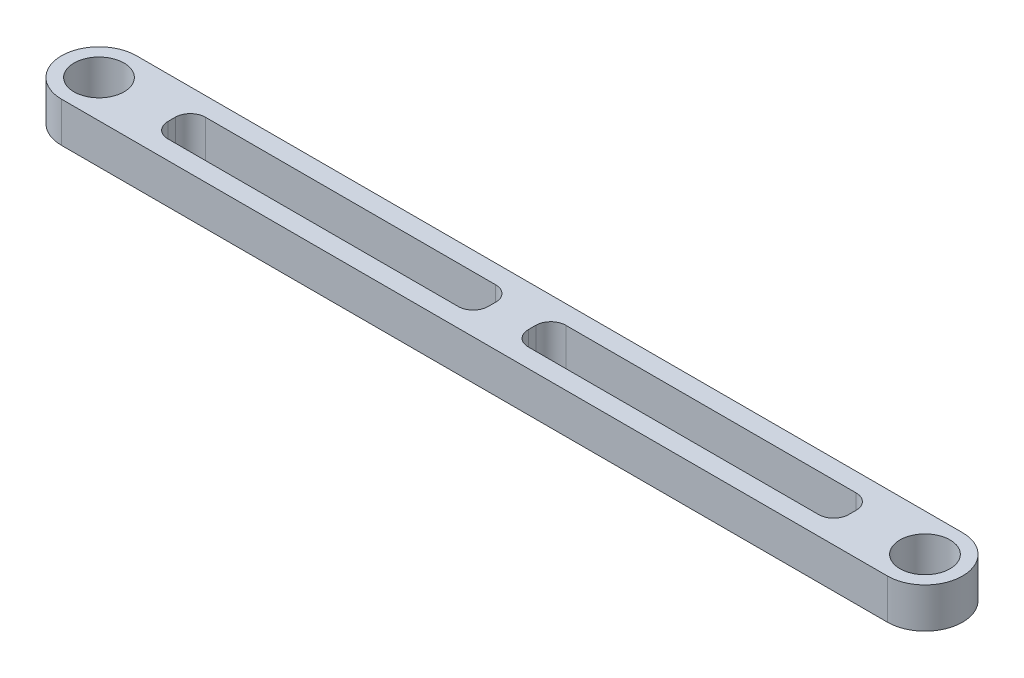
ISO-10303-21;
HEADER;
FILE_DESCRIPTION(('STEP AP214'),'2;1');
FILE_NAME('part.step','',(''),(''),'','','');
FILE_SCHEMA(('AUTOMOTIVE_DESIGN { 1 0 10303 214 1 1 1 1 }'));
ENDSEC;
DATA;
#1=APPLICATION_CONTEXT('core data for automotive mechanical design processes');
#2=APPLICATION_PROTOCOL_DEFINITION('international standard','automotive_design',2000,#1);
#3=PRODUCT_CONTEXT('',#1,'mechanical');
#4=PRODUCT('Part','Part','',(#3));
#5=PRODUCT_RELATED_PRODUCT_CATEGORY('part','',(#4));
#6=PRODUCT_DEFINITION_FORMATION('','',#4);
#7=PRODUCT_DEFINITION_CONTEXT('part definition',#1,'design');
#8=PRODUCT_DEFINITION('design','',#6,#7);
#9=PRODUCT_DEFINITION_SHAPE('','',#8);
#10=(LENGTH_UNIT() NAMED_UNIT(*) SI_UNIT(.MILLI.,.METRE.));
#11=(NAMED_UNIT(*) PLANE_ANGLE_UNIT() SI_UNIT($,.RADIAN.));
#12=(NAMED_UNIT(*) SI_UNIT($,.STERADIAN.) SOLID_ANGLE_UNIT());
#13=UNCERTAINTY_MEASURE_WITH_UNIT(LENGTH_MEASURE(1.E-05),#10,'distance_accuracy_value','');
#14=(GEOMETRIC_REPRESENTATION_CONTEXT(3) GLOBAL_UNCERTAINTY_ASSIGNED_CONTEXT((#13)) GLOBAL_UNIT_ASSIGNED_CONTEXT((#10,
#11,#12)) REPRESENTATION_CONTEXT('',''));
#15=CARTESIAN_POINT('',(0.,0.,0.));
#16=DIRECTION('',(0.,0.,1.));
#17=DIRECTION('',(1.,0.,0.));
#18=AXIS2_PLACEMENT_3D('',#15,#16,#17);
#19=CARTESIAN_POINT('',(0.,8.,-3.75));
#20=DIRECTION('',(0.,0.,1.));
#21=DIRECTION('',(1.,0.,0.));
#22=AXIS2_PLACEMENT_3D('',#19,#20,#21);
#23=PLANE('',#22);
#24=DIRECTION('',(-1.,0.,0.));
#25=VECTOR('',#24,1.);
#26=CARTESIAN_POINT('',(0.,0.,-3.75));
#27=LINE('',#26,#25);
#28=CARTESIAN_POINT('',(147.5,0.,-3.75));
#29=VERTEX_POINT('',#28);
#30=CARTESIAN_POINT('',(89.5,0.,-3.75));
#31=VERTEX_POINT('',#30);
#32=EDGE_CURVE('E331',#29,#31,#27,.T.);
#33=ORIENTED_EDGE('',*,*,#32,.F.);
#34=DIRECTION('',(0.,-1.,0.));
#35=VECTOR('',#34,1.);
#36=CARTESIAN_POINT('',(147.5,8.,-3.75));
#37=LINE('',#36,#35);
#38=CARTESIAN_POINT('',(147.5,8.,-3.75));
#39=VERTEX_POINT('',#38);
#40=EDGE_CURVE('E218',#29,#39,#37,.F.);
#41=ORIENTED_EDGE('',*,*,#40,.T.);
#42=DIRECTION('',(-1.,0.,0.));
#43=VECTOR('',#42,1.);
#44=CARTESIAN_POINT('',(0.,8.,-3.75));
#45=LINE('',#44,#43);
#46=CARTESIAN_POINT('',(89.5,8.,-3.75));
#47=VERTEX_POINT('',#46);
#48=EDGE_CURVE('E292',#39,#47,#45,.T.);
#49=ORIENTED_EDGE('',*,*,#48,.T.);
#50=DIRECTION('',(0.,-1.,0.));
#51=VECTOR('',#50,1.);
#52=CARTESIAN_POINT('',(89.5,0.,-3.75));
#53=LINE('',#52,#51);
#54=EDGE_CURVE('E215',#47,#31,#53,.T.);
#55=ORIENTED_EDGE('',*,*,#54,.T.);
#56=EDGE_LOOP('',(#33,#41,#49,#55));
#57=FACE_BOUND('',#56,.T.);
#58=ADVANCED_FACE('F37',(#57),#23,.T.);
#59=CARTESIAN_POINT('',(150.5,8.,0.));
#60=DIRECTION('',(1.,0.,0.));
#61=DIRECTION('',(0.,0.,-1.));
#62=AXIS2_PLACEMENT_3D('',#59,#60,#61);
#63=PLANE('',#62);
#64=DIRECTION('',(0.,0.,1.));
#65=VECTOR('',#64,1.);
#66=CARTESIAN_POINT('',(150.5,0.,0.));
#67=LINE('',#66,#65);
#68=CARTESIAN_POINT('',(150.5,0.,-0.749999999999999));
#69=VERTEX_POINT('',#68);
#70=CARTESIAN_POINT('',(150.5,0.,0.750000000000001));
#71=VERTEX_POINT('',#70);
#72=EDGE_CURVE('E334',#69,#71,#67,.T.);
#73=ORIENTED_EDGE('',*,*,#72,.T.);
#74=DIRECTION('',(0.,-1.,0.));
#75=VECTOR('',#74,1.);
#76=CARTESIAN_POINT('',(150.5,8.,0.750000000000001));
#77=LINE('',#76,#75);
#78=CARTESIAN_POINT('',(150.5,8.,0.750000000000001));
#79=VERTEX_POINT('',#78);
#80=EDGE_CURVE('E213',#71,#79,#77,.F.);
#81=ORIENTED_EDGE('',*,*,#80,.T.);
#82=DIRECTION('',(0.,0.,1.));
#83=VECTOR('',#82,1.);
#84=CARTESIAN_POINT('',(150.5,8.,0.));
#85=LINE('',#84,#83);
#86=CARTESIAN_POINT('',(150.5,8.,-0.749999999999999));
#87=VERTEX_POINT('',#86);
#88=EDGE_CURVE('E296',#87,#79,#85,.T.);
#89=ORIENTED_EDGE('',*,*,#88,.F.);
#90=DIRECTION('',(0.,-1.,0.));
#91=VECTOR('',#90,1.);
#92=CARTESIAN_POINT('',(150.5,8.,-0.749999999999999));
#93=LINE('',#92,#91);
#94=EDGE_CURVE('E210',#87,#69,#93,.T.);
#95=ORIENTED_EDGE('',*,*,#94,.T.);
#96=EDGE_LOOP('',(#73,#81,#89,#95));
#97=FACE_BOUND('',#96,.T.);
#98=ADVANCED_FACE('F388',(#97),#63,.F.);
#99=CARTESIAN_POINT('',(0.,8.,3.75));
#100=DIRECTION('',(0.,0.,1.));
#101=DIRECTION('',(1.,0.,0.));
#102=AXIS2_PLACEMENT_3D('',#99,#100,#101);
#103=PLANE('',#102);
#104=DIRECTION('',(-1.,0.,0.));
#105=VECTOR('',#104,1.);
#106=CARTESIAN_POINT('',(0.,8.,3.75));
#107=LINE('',#106,#105);
#108=CARTESIAN_POINT('',(147.5,8.,3.75));
#109=VERTEX_POINT('',#108);
#110=CARTESIAN_POINT('',(89.5,8.,3.75));
#111=VERTEX_POINT('',#110);
#112=EDGE_CURVE('E304',#109,#111,#107,.T.);
#113=ORIENTED_EDGE('',*,*,#112,.F.);
#114=DIRECTION('',(0.,-1.,0.));
#115=VECTOR('',#114,1.);
#116=CARTESIAN_POINT('',(147.5,0.,3.75));
#117=LINE('',#116,#115);
#118=CARTESIAN_POINT('',(147.5,0.,3.75));
#119=VERTEX_POINT('',#118);
#120=EDGE_CURVE('E202',#109,#119,#117,.T.);
#121=ORIENTED_EDGE('',*,*,#120,.T.);
#122=DIRECTION('',(-1.,0.,0.));
#123=VECTOR('',#122,1.);
#124=CARTESIAN_POINT('',(0.,0.,3.75));
#125=LINE('',#124,#123);
#126=CARTESIAN_POINT('',(89.5,0.,3.75));
#127=VERTEX_POINT('',#126);
#128=EDGE_CURVE('E337',#119,#127,#125,.T.);
#129=ORIENTED_EDGE('',*,*,#128,.T.);
#130=DIRECTION('',(0.,-1.,0.));
#131=VECTOR('',#130,1.);
#132=CARTESIAN_POINT('',(89.5,8.,3.75));
#133=LINE('',#132,#131);
#134=EDGE_CURVE('E200',#127,#111,#133,.F.);
#135=ORIENTED_EDGE('',*,*,#134,.T.);
#136=EDGE_LOOP('',(#113,#121,#129,#135));
#137=FACE_BOUND('',#136,.T.);
#138=ADVANCED_FACE('F394',(#137),#103,.F.);
#139=CARTESIAN_POINT('',(0.,8.,-3.75));
#140=DIRECTION('',(0.,0.,-1.));
#141=DIRECTION('',(-1.,0.,0.));
#142=AXIS2_PLACEMENT_3D('',#139,#140,#141);
#143=PLANE('',#142);
#144=DIRECTION('',(1.,0.,0.));
#145=VECTOR('',#144,1.);
#146=CARTESIAN_POINT('',(0.,0.,-3.75));
#147=LINE('',#146,#145);
#148=CARTESIAN_POINT('',(17.5,0.,-3.75));
#149=VERTEX_POINT('',#148);
#150=CARTESIAN_POINT('',(75.5,0.,-3.75));
#151=VERTEX_POINT('',#150);
#152=EDGE_CURVE('E325',#149,#151,#147,.T.);
#153=ORIENTED_EDGE('',*,*,#152,.T.);
#154=DIRECTION('',(0.,-1.,0.));
#155=VECTOR('',#154,1.);
#156=CARTESIAN_POINT('',(75.5,8.,-3.75));
#157=LINE('',#156,#155);
#158=CARTESIAN_POINT('',(75.5,8.,-3.75));
#159=VERTEX_POINT('',#158);
#160=EDGE_CURVE('E238',#151,#159,#157,.F.);
#161=ORIENTED_EDGE('',*,*,#160,.T.);
#162=DIRECTION('',(1.,0.,0.));
#163=VECTOR('',#162,1.);
#164=CARTESIAN_POINT('',(0.,8.,-3.75));
#165=LINE('',#164,#163);
#166=CARTESIAN_POINT('',(17.5,8.,-3.75));
#167=VERTEX_POINT('',#166);
#168=EDGE_CURVE('E356',#167,#159,#165,.T.);
#169=ORIENTED_EDGE('',*,*,#168,.F.);
#170=DIRECTION('',(0.,-1.,0.));
#171=VECTOR('',#170,1.);
#172=CARTESIAN_POINT('',(17.5,8.,-3.75));
#173=LINE('',#172,#171);
#174=EDGE_CURVE('E235',#167,#149,#173,.T.);
#175=ORIENTED_EDGE('',*,*,#174,.T.);
#176=EDGE_LOOP('',(#153,#161,#169,#175));
#177=FACE_BOUND('',#176,.T.);
#178=ADVANCED_FACE('F376',(#177),#143,.F.);
#179=CARTESIAN_POINT('',(78.5,8.,0.));
#180=DIRECTION('',(1.,0.,0.));
#181=DIRECTION('',(0.,0.,-1.));
#182=AXIS2_PLACEMENT_3D('',#179,#180,#181);
#183=PLANE('',#182);
#184=DIRECTION('',(0.,0.,1.));
#185=VECTOR('',#184,1.);
#186=CARTESIAN_POINT('',(78.5,0.,0.));
#187=LINE('',#186,#185);
#188=CARTESIAN_POINT('',(78.5,0.,-0.749999999999999));
#189=VERTEX_POINT('',#188);
#190=CARTESIAN_POINT('',(78.5,0.,0.750000000000001));
#191=VERTEX_POINT('',#190);
#192=EDGE_CURVE('E287',#189,#191,#187,.T.);
#193=ORIENTED_EDGE('',*,*,#192,.T.);
#194=DIRECTION('',(0.,-1.,0.));
#195=VECTOR('',#194,1.);
#196=CARTESIAN_POINT('',(78.5,8.,0.750000000000001));
#197=LINE('',#196,#195);
#198=CARTESIAN_POINT('',(78.5,8.,0.750000000000001));
#199=VERTEX_POINT('',#198);
#200=EDGE_CURVE('E233',#191,#199,#197,.F.);
#201=ORIENTED_EDGE('',*,*,#200,.T.);
#202=DIRECTION('',(0.,0.,1.));
#203=VECTOR('',#202,1.);
#204=CARTESIAN_POINT('',(78.5,8.,0.));
#205=LINE('',#204,#203);
#206=CARTESIAN_POINT('',(78.5,8.,-0.749999999999999));
#207=VERTEX_POINT('',#206);
#208=EDGE_CURVE('E298',#207,#199,#205,.T.);
#209=ORIENTED_EDGE('',*,*,#208,.F.);
#210=DIRECTION('',(0.,-1.,0.));
#211=VECTOR('',#210,1.);
#212=CARTESIAN_POINT('',(78.5,0.,-0.749999999999999));
#213=LINE('',#212,#211);
#214=EDGE_CURVE('E230',#207,#189,#213,.T.);
#215=ORIENTED_EDGE('',*,*,#214,.T.);
#216=EDGE_LOOP('',(#193,#201,#209,#215));
#217=FACE_BOUND('',#216,.T.);
#218=ADVANCED_FACE('F371',(#217),#183,.F.);
#219=CARTESIAN_POINT('',(0.,8.,3.75));
#220=DIRECTION('',(0.,0.,-1.));
#221=DIRECTION('',(-1.,0.,0.));
#222=AXIS2_PLACEMENT_3D('',#219,#220,#221);
#223=PLANE('',#222);
#224=DIRECTION('',(1.,0.,0.));
#225=VECTOR('',#224,1.);
#226=CARTESIAN_POINT('',(0.,8.,3.75));
#227=LINE('',#226,#225);
#228=CARTESIAN_POINT('',(17.5,8.,3.75));
#229=VERTEX_POINT('',#228);
#230=CARTESIAN_POINT('',(75.5,8.,3.75));
#231=VERTEX_POINT('',#230);
#232=EDGE_CURVE('E293',#229,#231,#227,.T.);
#233=ORIENTED_EDGE('',*,*,#232,.T.);
#234=DIRECTION('',(0.,-1.,0.));
#235=VECTOR('',#234,1.);
#236=CARTESIAN_POINT('',(75.5,8.,3.75));
#237=LINE('',#236,#235);
#238=CARTESIAN_POINT('',(75.5,0.,3.75));
#239=VERTEX_POINT('',#238);
#240=EDGE_CURVE('E227',#231,#239,#237,.T.);
#241=ORIENTED_EDGE('',*,*,#240,.T.);
#242=DIRECTION('',(1.,0.,0.));
#243=VECTOR('',#242,1.);
#244=CARTESIAN_POINT('',(0.,0.,3.75));
#245=LINE('',#244,#243);
#246=CARTESIAN_POINT('',(17.5,0.,3.75));
#247=VERTEX_POINT('',#246);
#248=EDGE_CURVE('E278',#247,#239,#245,.T.);
#249=ORIENTED_EDGE('',*,*,#248,.F.);
#250=DIRECTION('',(0.,-1.,0.));
#251=VECTOR('',#250,1.);
#252=CARTESIAN_POINT('',(17.5,8.,3.75));
#253=LINE('',#252,#251);
#254=EDGE_CURVE('E225',#247,#229,#253,.F.);
#255=ORIENTED_EDGE('',*,*,#254,.T.);
#256=EDGE_LOOP('',(#233,#241,#249,#255));
#257=FACE_BOUND('',#256,.T.);
#258=ADVANCED_FACE('F285',(#257),#223,.T.);
#259=CARTESIAN_POINT('',(0.,8.,7.5));
#260=DIRECTION('',(0.,0.,-1.));
#261=DIRECTION('',(-1.,0.,0.));
#262=AXIS2_PLACEMENT_3D('',#259,#260,#261);
#263=PLANE('',#262);
#264=DIRECTION('',(1.,0.,0.));
#265=VECTOR('',#264,1.);
#266=CARTESIAN_POINT('',(0.,0.,7.5));
#267=LINE('',#266,#265);
#268=CARTESIAN_POINT('',(0.,0.,7.5));
#269=VERTEX_POINT('',#268);
#270=CARTESIAN_POINT('',(165.,0.,7.50000000000001));
#271=VERTEX_POINT('',#270);
#272=EDGE_CURVE('E199',#269,#271,#267,.T.);
#273=ORIENTED_EDGE('',*,*,#272,.T.);
#274=DIRECTION('',(0.,-1.,0.));
#275=VECTOR('',#274,1.);
#276=CARTESIAN_POINT('',(165.,8.,7.50000000000001));
#277=LINE('',#276,#275);
#278=CARTESIAN_POINT('',(165.,8.,7.50000000000001));
#279=VERTEX_POINT('',#278);
#280=EDGE_CURVE('E179',#279,#271,#277,.T.);
#281=ORIENTED_EDGE('',*,*,#280,.F.);
#282=DIRECTION('',(1.,0.,0.));
#283=VECTOR('',#282,1.);
#284=CARTESIAN_POINT('',(0.,8.,7.5));
#285=LINE('',#284,#283);
#286=CARTESIAN_POINT('',(0.,8.,7.5));
#287=VERTEX_POINT('',#286);
#288=EDGE_CURVE('E186',#287,#279,#285,.T.);
#289=ORIENTED_EDGE('',*,*,#288,.F.);
#290=DIRECTION('',(0.,-1.,0.));
#291=VECTOR('',#290,1.);
#292=CARTESIAN_POINT('',(0.,8.,7.5));
#293=LINE('',#292,#291);
#294=EDGE_CURVE('E316',#287,#269,#293,.T.);
#295=ORIENTED_EDGE('',*,*,#294,.T.);
#296=EDGE_LOOP('',(#273,#281,#289,#295));
#297=FACE_BOUND('',#296,.T.);
#298=ADVANCED_FACE('F197',(#297),#263,.F.);
#299=CARTESIAN_POINT('',(165.,8.,0.));
#300=DIRECTION('',(0.,-1.,0.));
#301=DIRECTION('',(0.,0.,-1.));
#302=AXIS2_PLACEMENT_3D('',#299,#300,#301);
#303=CYLINDRICAL_SURFACE('',#302,7.50000000000001);
#304=CARTESIAN_POINT('',(165.,0.,0.));
#305=DIRECTION('',(0.,1.,0.));
#306=DIRECTION('',(0.,0.,1.));
#307=AXIS2_PLACEMENT_3D('',#304,#305,#306);
#308=CIRCLE('',#307,7.50000000000001);
#309=CARTESIAN_POINT('',(165.,0.,-7.50000000000001));
#310=VERTEX_POINT('',#309);
#311=EDGE_CURVE('E318',#271,#310,#308,.T.);
#312=ORIENTED_EDGE('',*,*,#311,.T.);
#313=DIRECTION('',(0.,-1.,0.));
#314=VECTOR('',#313,1.);
#315=CARTESIAN_POINT('',(165.,8.,-7.50000000000001));
#316=LINE('',#315,#314);
#317=CARTESIAN_POINT('',(165.,8.,-7.50000000000001));
#318=VERTEX_POINT('',#317);
#319=EDGE_CURVE('E181',#318,#310,#316,.T.);
#320=ORIENTED_EDGE('',*,*,#319,.F.);
#321=CARTESIAN_POINT('',(165.,8.,0.));
#322=DIRECTION('',(0.,1.,0.));
#323=DIRECTION('',(0.,0.,1.));
#324=AXIS2_PLACEMENT_3D('',#321,#322,#323);
#325=CIRCLE('',#324,7.50000000000001);
#326=EDGE_CURVE('E174',#279,#318,#325,.T.);
#327=ORIENTED_EDGE('',*,*,#326,.F.);
#328=ORIENTED_EDGE('',*,*,#280,.T.);
#329=EDGE_LOOP('',(#312,#320,#327,#328));
#330=FACE_BOUND('',#329,.T.);
#331=ADVANCED_FACE('F177',(#330),#303,.T.);
#332=CARTESIAN_POINT('',(0.,8.,-7.5));
#333=DIRECTION('',(0.,0.,-1.));
#334=DIRECTION('',(-1.,0.,0.));
#335=AXIS2_PLACEMENT_3D('',#332,#333,#334);
#336=PLANE('',#335);
#337=DIRECTION('',(1.,0.,0.));
#338=VECTOR('',#337,1.);
#339=CARTESIAN_POINT('',(0.,0.,-7.5));
#340=LINE('',#339,#338);
#341=CARTESIAN_POINT('',(0.,0.,-7.5));
#342=VERTEX_POINT('',#341);
#343=EDGE_CURVE('E320',#342,#310,#340,.T.);
#344=ORIENTED_EDGE('',*,*,#343,.F.);
#345=DIRECTION('',(0.,-1.,0.));
#346=VECTOR('',#345,1.);
#347=CARTESIAN_POINT('',(0.,8.,-7.5));
#348=LINE('',#347,#346);
#349=CARTESIAN_POINT('',(0.,8.,-7.5));
#350=VERTEX_POINT('',#349);
#351=EDGE_CURVE('E204',#350,#342,#348,.T.);
#352=ORIENTED_EDGE('',*,*,#351,.F.);
#353=DIRECTION('',(1.,0.,0.));
#354=VECTOR('',#353,1.);
#355=CARTESIAN_POINT('',(0.,8.,-7.5));
#356=LINE('',#355,#354);
#357=EDGE_CURVE('E185',#350,#318,#356,.T.);
#358=ORIENTED_EDGE('',*,*,#357,.T.);
#359=ORIENTED_EDGE('',*,*,#319,.T.);
#360=EDGE_LOOP('',(#344,#352,#358,#359));
#361=FACE_BOUND('',#360,.T.);
#362=ADVANCED_FACE('F354',(#361),#336,.T.);
#363=CARTESIAN_POINT('',(0.,8.,0.));
#364=DIRECTION('',(0.,-1.,0.));
#365=DIRECTION('',(0.,0.,-1.));
#366=AXIS2_PLACEMENT_3D('',#363,#364,#365);
#367=CYLINDRICAL_SURFACE('',#366,5.);
#368=CARTESIAN_POINT('',(0.,8.,0.));
#369=DIRECTION('',(0.,1.,0.));
#370=DIRECTION('',(0.,0.,1.));
#371=AXIS2_PLACEMENT_3D('',#368,#369,#370);
#372=CIRCLE('',#371,5.);
#373=CARTESIAN_POINT('',(0.,8.,5.));
#374=VERTEX_POINT('',#373);
#375=EDGE_CURVE('E310',#374,#374,#372,.T.);
#376=ORIENTED_EDGE('',*,*,#375,.T.);
#377=EDGE_LOOP('',(#376));
#378=FACE_BOUND('',#377,.T.);
#379=CARTESIAN_POINT('',(0.,0.,0.));
#380=DIRECTION('',(0.,1.,0.));
#381=DIRECTION('',(0.,0.,1.));
#382=AXIS2_PLACEMENT_3D('',#379,#380,#381);
#383=CIRCLE('',#382,5.);
#384=CARTESIAN_POINT('',(0.,0.,5.));
#385=VERTEX_POINT('',#384);
#386=EDGE_CURVE('E343',#385,#385,#383,.T.);
#387=ORIENTED_EDGE('',*,*,#386,.F.);
#388=EDGE_LOOP('',(#387));
#389=FACE_BOUND('',#388,.T.);
#390=ADVANCED_FACE('F414',(#378,#389),#367,.F.);
#391=CARTESIAN_POINT('',(86.5,8.,0.));
#392=DIRECTION('',(1.,0.,0.));
#393=DIRECTION('',(0.,0.,-1.));
#394=AXIS2_PLACEMENT_3D('',#391,#392,#393);
#395=PLANE('',#394);
#396=DIRECTION('',(0.,0.,1.));
#397=VECTOR('',#396,1.);
#398=CARTESIAN_POINT('',(86.5,8.,0.));
#399=LINE('',#398,#397);
#400=CARTESIAN_POINT('',(86.5,8.,-0.749999999999999));
#401=VERTEX_POINT('',#400);
#402=CARTESIAN_POINT('',(86.5,8.,0.750000000000001));
#403=VERTEX_POINT('',#402);
#404=EDGE_CURVE('E307',#401,#403,#399,.T.);
#405=ORIENTED_EDGE('',*,*,#404,.T.);
#406=DIRECTION('',(0.,-1.,0.));
#407=VECTOR('',#406,1.);
#408=CARTESIAN_POINT('',(86.5,8.,0.750000000000001));
#409=LINE('',#408,#407);
#410=CARTESIAN_POINT('',(86.5,0.,0.750000000000001));
#411=VERTEX_POINT('',#410);
#412=EDGE_CURVE('E222',#403,#411,#409,.T.);
#413=ORIENTED_EDGE('',*,*,#412,.T.);
#414=DIRECTION('',(0.,0.,1.));
#415=VECTOR('',#414,1.);
#416=CARTESIAN_POINT('',(86.5,0.,0.));
#417=LINE('',#416,#415);
#418=CARTESIAN_POINT('',(86.5,0.,-0.749999999999999));
#419=VERTEX_POINT('',#418);
#420=EDGE_CURVE('E340',#419,#411,#417,.T.);
#421=ORIENTED_EDGE('',*,*,#420,.F.);
#422=DIRECTION('',(0.,-1.,0.));
#423=VECTOR('',#422,1.);
#424=CARTESIAN_POINT('',(86.5,8.,-0.749999999999999));
#425=LINE('',#424,#423);
#426=EDGE_CURVE('E220',#419,#401,#425,.F.);
#427=ORIENTED_EDGE('',*,*,#426,.T.);
#428=EDGE_LOOP('',(#405,#413,#421,#427));
#429=FACE_BOUND('',#428,.T.);
#430=ADVANCED_FACE('F402',(#429),#395,.T.);
#431=CARTESIAN_POINT('',(14.5,8.,0.));
#432=DIRECTION('',(1.,0.,0.));
#433=DIRECTION('',(0.,0.,-1.));
#434=AXIS2_PLACEMENT_3D('',#431,#432,#433);
#435=PLANE('',#434);
#436=DIRECTION('',(0.,0.,1.));
#437=VECTOR('',#436,1.);
#438=CARTESIAN_POINT('',(14.5,0.,0.));
#439=LINE('',#438,#437);
#440=CARTESIAN_POINT('',(14.5,0.,-0.749999999999999));
#441=VERTEX_POINT('',#440);
#442=CARTESIAN_POINT('',(14.5,0.,0.750000000000001));
#443=VERTEX_POINT('',#442);
#444=EDGE_CURVE('E279',#441,#443,#439,.T.);
#445=ORIENTED_EDGE('',*,*,#444,.F.);
#446=DIRECTION('',(0.,-1.,0.));
#447=VECTOR('',#446,1.);
#448=CARTESIAN_POINT('',(14.5,8.,-0.749999999999999));
#449=LINE('',#448,#447);
#450=CARTESIAN_POINT('',(14.5,8.,-0.749999999999999));
#451=VERTEX_POINT('',#450);
#452=EDGE_CURVE('E57',#441,#451,#449,.F.);
#453=ORIENTED_EDGE('',*,*,#452,.T.);
#454=DIRECTION('',(0.,0.,1.));
#455=VECTOR('',#454,1.);
#456=CARTESIAN_POINT('',(14.5,8.,0.));
#457=LINE('',#456,#455);
#458=CARTESIAN_POINT('',(14.5,8.,0.750000000000001));
#459=VERTEX_POINT('',#458);
#460=EDGE_CURVE('E290',#451,#459,#457,.T.);
#461=ORIENTED_EDGE('',*,*,#460,.T.);
#462=DIRECTION('',(0.,-1.,0.));
#463=VECTOR('',#462,1.);
#464=CARTESIAN_POINT('',(14.5,0.,0.750000000000001));
#465=LINE('',#464,#463);
#466=EDGE_CURVE('E240',#459,#443,#465,.T.);
#467=ORIENTED_EDGE('',*,*,#466,.T.);
#468=EDGE_LOOP('',(#445,#453,#461,#467));
#469=FACE_BOUND('',#468,.T.);
#470=ADVANCED_FACE('F289',(#469),#435,.T.);
#471=CARTESIAN_POINT('',(0.,8.,0.));
#472=DIRECTION('',(0.,-1.,0.));
#473=DIRECTION('',(0.,0.,-1.));
#474=AXIS2_PLACEMENT_3D('',#471,#472,#473);
#475=CYLINDRICAL_SURFACE('',#474,7.5);
#476=CARTESIAN_POINT('',(0.,0.,0.));
#477=DIRECTION('',(0.,1.,0.));
#478=DIRECTION('',(0.,0.,1.));
#479=AXIS2_PLACEMENT_3D('',#476,#477,#478);
#480=CIRCLE('',#479,7.5);
#481=EDGE_CURVE('E323',#342,#269,#480,.T.);
#482=ORIENTED_EDGE('',*,*,#481,.T.);
#483=ORIENTED_EDGE('',*,*,#294,.F.);
#484=CARTESIAN_POINT('',(0.,8.,0.));
#485=DIRECTION('',(0.,1.,0.));
#486=DIRECTION('',(0.,0.,1.));
#487=AXIS2_PLACEMENT_3D('',#484,#485,#486);
#488=CIRCLE('',#487,7.5);
#489=EDGE_CURVE('E191',#350,#287,#488,.T.);
#490=ORIENTED_EDGE('',*,*,#489,.F.);
#491=ORIENTED_EDGE('',*,*,#351,.T.);
#492=EDGE_LOOP('',(#482,#483,#490,#491));
#493=FACE_BOUND('',#492,.T.);
#494=ADVANCED_FACE('F350',(#493),#475,.T.);
#495=CARTESIAN_POINT('',(165.,8.,0.));
#496=DIRECTION('',(0.,-1.,0.));
#497=DIRECTION('',(0.,0.,-1.));
#498=AXIS2_PLACEMENT_3D('',#495,#496,#497);
#499=CYLINDRICAL_SURFACE('',#498,4.99999999999999);
#500=CARTESIAN_POINT('',(165.,8.,0.));
#501=DIRECTION('',(0.,1.,0.));
#502=DIRECTION('',(0.,0.,1.));
#503=AXIS2_PLACEMENT_3D('',#500,#501,#502);
#504=CIRCLE('',#503,4.99999999999999);
#505=CARTESIAN_POINT('',(165.,8.,4.99999999999999));
#506=VERTEX_POINT('',#505);
#507=EDGE_CURVE('E313',#506,#506,#504,.T.);
#508=ORIENTED_EDGE('',*,*,#507,.T.);
#509=EDGE_LOOP('',(#508));
#510=FACE_BOUND('',#509,.T.);
#511=CARTESIAN_POINT('',(165.,0.,0.));
#512=DIRECTION('',(0.,1.,0.));
#513=DIRECTION('',(0.,0.,1.));
#514=AXIS2_PLACEMENT_3D('',#511,#512,#513);
#515=CIRCLE('',#514,4.99999999999999);
#516=CARTESIAN_POINT('',(165.,0.,4.99999999999999));
#517=VERTEX_POINT('',#516);
#518=EDGE_CURVE('E195',#517,#517,#515,.T.);
#519=ORIENTED_EDGE('',*,*,#518,.F.);
#520=EDGE_LOOP('',(#519));
#521=FACE_BOUND('',#520,.T.);
#522=ADVANCED_FACE('F411',(#510,#521),#499,.F.);
#523=CARTESIAN_POINT('',(0.,8.,0.));
#524=DIRECTION('',(0.,1.,0.));
#525=DIRECTION('',(0.,0.,1.));
#526=AXIS2_PLACEMENT_3D('',#523,#524,#525);
#527=PLANE('',#526);
#528=ORIENTED_EDGE('',*,*,#288,.T.);
#529=ORIENTED_EDGE('',*,*,#326,.T.);
#530=ORIENTED_EDGE('',*,*,#357,.F.);
#531=ORIENTED_EDGE('',*,*,#489,.T.);
#532=EDGE_LOOP('',(#528,#529,#530,#531));
#533=FACE_BOUND('',#532,.T.);
#534=ORIENTED_EDGE('',*,*,#460,.F.);
#535=CARTESIAN_POINT('',(17.5,8.,-0.749999999999999));
#536=DIRECTION('',(0.,1.,0.));
#537=DIRECTION('',(0.,0.,1.));
#538=AXIS2_PLACEMENT_3D('',#535,#536,#537);
#539=CIRCLE('',#538,3.);
#540=EDGE_CURVE('E270',#451,#167,#539,.F.);
#541=ORIENTED_EDGE('',*,*,#540,.T.);
#542=ORIENTED_EDGE('',*,*,#168,.T.);
#543=CARTESIAN_POINT('',(75.5,8.,-0.749999999999999));
#544=DIRECTION('',(0.,1.,0.));
#545=DIRECTION('',(0.,0.,1.));
#546=AXIS2_PLACEMENT_3D('',#543,#544,#545);
#547=CIRCLE('',#546,3.);
#548=EDGE_CURVE('E266',#159,#207,#547,.F.);
#549=ORIENTED_EDGE('',*,*,#548,.T.);
#550=ORIENTED_EDGE('',*,*,#208,.T.);
#551=CARTESIAN_POINT('',(75.5,8.,0.750000000000001));
#552=DIRECTION('',(0.,1.,0.));
#553=DIRECTION('',(0.,0.,1.));
#554=AXIS2_PLACEMENT_3D('',#551,#552,#553);
#555=CIRCLE('',#554,3.);
#556=EDGE_CURVE('E262',#199,#231,#555,.F.);
#557=ORIENTED_EDGE('',*,*,#556,.T.);
#558=ORIENTED_EDGE('',*,*,#232,.F.);
#559=CARTESIAN_POINT('',(17.5,8.,0.750000000000001));
#560=DIRECTION('',(0.,1.,0.));
#561=DIRECTION('',(0.,0.,1.));
#562=AXIS2_PLACEMENT_3D('',#559,#560,#561);
#563=CIRCLE('',#562,3.);
#564=EDGE_CURVE('E11',#229,#459,#563,.F.);
#565=ORIENTED_EDGE('',*,*,#564,.T.);
#566=EDGE_LOOP('',(#534,#541,#542,#549,#550,#557,#558,#565));
#567=FACE_BOUND('',#566,.T.);
#568=ORIENTED_EDGE('',*,*,#48,.F.);
#569=CARTESIAN_POINT('',(147.5,8.,-0.749999999999999));
#570=DIRECTION('',(0.,1.,0.));
#571=DIRECTION('',(0.,0.,1.));
#572=AXIS2_PLACEMENT_3D('',#569,#570,#571);
#573=CIRCLE('',#572,3.);
#574=EDGE_CURVE('E250',#39,#87,#573,.F.);
#575=ORIENTED_EDGE('',*,*,#574,.T.);
#576=ORIENTED_EDGE('',*,*,#88,.T.);
#577=CARTESIAN_POINT('',(147.5,8.,0.750000000000001));
#578=DIRECTION('',(0.,1.,0.));
#579=DIRECTION('',(0.,0.,1.));
#580=AXIS2_PLACEMENT_3D('',#577,#578,#579);
#581=CIRCLE('',#580,3.);
#582=EDGE_CURVE('E246',#79,#109,#581,.F.);
#583=ORIENTED_EDGE('',*,*,#582,.T.);
#584=ORIENTED_EDGE('',*,*,#112,.T.);
#585=CARTESIAN_POINT('',(89.5,8.,0.750000000000001));
#586=DIRECTION('',(0.,1.,0.));
#587=DIRECTION('',(0.,0.,1.));
#588=AXIS2_PLACEMENT_3D('',#585,#586,#587);
#589=CIRCLE('',#588,3.);
#590=EDGE_CURVE('E254',#111,#403,#589,.F.);
#591=ORIENTED_EDGE('',*,*,#590,.T.);
#592=ORIENTED_EDGE('',*,*,#404,.F.);
#593=CARTESIAN_POINT('',(89.5,8.,-0.749999999999999));
#594=DIRECTION('',(0.,1.,0.));
#595=DIRECTION('',(0.,0.,1.));
#596=AXIS2_PLACEMENT_3D('',#593,#594,#595);
#597=CIRCLE('',#596,3.);
#598=EDGE_CURVE('E258',#401,#47,#597,.F.);
#599=ORIENTED_EDGE('',*,*,#598,.T.);
#600=EDGE_LOOP('',(#568,#575,#576,#583,#584,#591,#592,#599));
#601=FACE_BOUND('',#600,.T.);
#602=ORIENTED_EDGE('',*,*,#375,.F.);
#603=EDGE_LOOP('',(#602));
#604=FACE_BOUND('',#603,.T.);
#605=ORIENTED_EDGE('',*,*,#507,.F.);
#606=EDGE_LOOP('',(#605));
#607=FACE_BOUND('',#606,.T.);
#608=ADVANCED_FACE('F189',(#533,#567,#601,#604,#607),#527,.T.);
#609=CARTESIAN_POINT('',(0.,0.,0.));
#610=DIRECTION('',(0.,1.,0.));
#611=DIRECTION('',(0.,0.,1.));
#612=AXIS2_PLACEMENT_3D('',#609,#610,#611);
#613=PLANE('',#612);
#614=ORIENTED_EDGE('',*,*,#272,.F.);
#615=ORIENTED_EDGE('',*,*,#481,.F.);
#616=ORIENTED_EDGE('',*,*,#343,.T.);
#617=ORIENTED_EDGE('',*,*,#311,.F.);
#618=EDGE_LOOP('',(#614,#615,#616,#617));
#619=FACE_BOUND('',#618,.T.);
#620=ORIENTED_EDGE('',*,*,#152,.F.);
#621=CARTESIAN_POINT('',(17.5,0.,-0.749999999999999));
#622=DIRECTION('',(0.,1.,0.));
#623=DIRECTION('',(0.,0.,1.));
#624=AXIS2_PLACEMENT_3D('',#621,#622,#623);
#625=CIRCLE('',#624,3.);
#626=EDGE_CURVE('E268',#149,#441,#625,.T.);
#627=ORIENTED_EDGE('',*,*,#626,.T.);
#628=ORIENTED_EDGE('',*,*,#444,.T.);
#629=CARTESIAN_POINT('',(17.5,0.,0.750000000000001));
#630=DIRECTION('',(0.,1.,0.));
#631=DIRECTION('',(0.,0.,1.));
#632=AXIS2_PLACEMENT_3D('',#629,#630,#631);
#633=CIRCLE('',#632,3.);
#634=EDGE_CURVE('E45',#443,#247,#633,.T.);
#635=ORIENTED_EDGE('',*,*,#634,.T.);
#636=ORIENTED_EDGE('',*,*,#248,.T.);
#637=CARTESIAN_POINT('',(75.5,0.,0.750000000000001));
#638=DIRECTION('',(0.,1.,0.));
#639=DIRECTION('',(0.,0.,1.));
#640=AXIS2_PLACEMENT_3D('',#637,#638,#639);
#641=CIRCLE('',#640,3.);
#642=EDGE_CURVE('E260',#239,#191,#641,.T.);
#643=ORIENTED_EDGE('',*,*,#642,.T.);
#644=ORIENTED_EDGE('',*,*,#192,.F.);
#645=CARTESIAN_POINT('',(75.5,0.,-0.749999999999999));
#646=DIRECTION('',(0.,1.,0.));
#647=DIRECTION('',(0.,0.,1.));
#648=AXIS2_PLACEMENT_3D('',#645,#646,#647);
#649=CIRCLE('',#648,3.);
#650=EDGE_CURVE('E264',#189,#151,#649,.T.);
#651=ORIENTED_EDGE('',*,*,#650,.T.);
#652=EDGE_LOOP('',(#620,#627,#628,#635,#636,#643,#644,#651));
#653=FACE_BOUND('',#652,.T.);
#654=ORIENTED_EDGE('',*,*,#72,.F.);
#655=CARTESIAN_POINT('',(147.5,0.,-0.749999999999999));
#656=DIRECTION('',(0.,1.,0.));
#657=DIRECTION('',(0.,0.,1.));
#658=AXIS2_PLACEMENT_3D('',#655,#656,#657);
#659=CIRCLE('',#658,3.);
#660=EDGE_CURVE('E248',#69,#29,#659,.T.);
#661=ORIENTED_EDGE('',*,*,#660,.T.);
#662=ORIENTED_EDGE('',*,*,#32,.T.);
#663=CARTESIAN_POINT('',(89.5,0.,-0.749999999999999));
#664=DIRECTION('',(0.,1.,0.));
#665=DIRECTION('',(0.,0.,1.));
#666=AXIS2_PLACEMENT_3D('',#663,#664,#665);
#667=CIRCLE('',#666,3.);
#668=EDGE_CURVE('E256',#31,#419,#667,.T.);
#669=ORIENTED_EDGE('',*,*,#668,.T.);
#670=ORIENTED_EDGE('',*,*,#420,.T.);
#671=CARTESIAN_POINT('',(89.5,0.,0.750000000000001));
#672=DIRECTION('',(0.,1.,0.));
#673=DIRECTION('',(0.,0.,1.));
#674=AXIS2_PLACEMENT_3D('',#671,#672,#673);
#675=CIRCLE('',#674,3.);
#676=EDGE_CURVE('E252',#411,#127,#675,.T.);
#677=ORIENTED_EDGE('',*,*,#676,.T.);
#678=ORIENTED_EDGE('',*,*,#128,.F.);
#679=CARTESIAN_POINT('',(147.5,0.,0.750000000000001));
#680=DIRECTION('',(0.,1.,0.));
#681=DIRECTION('',(0.,0.,1.));
#682=AXIS2_PLACEMENT_3D('',#679,#680,#681);
#683=CIRCLE('',#682,3.);
#684=EDGE_CURVE('E244',#119,#71,#683,.T.);
#685=ORIENTED_EDGE('',*,*,#684,.T.);
#686=EDGE_LOOP('',(#654,#661,#662,#669,#670,#677,#678,#685));
#687=FACE_BOUND('',#686,.T.);
#688=ORIENTED_EDGE('',*,*,#386,.T.);
#689=EDGE_LOOP('',(#688));
#690=FACE_BOUND('',#689,.T.);
#691=ORIENTED_EDGE('',*,*,#518,.T.);
#692=EDGE_LOOP('',(#691));
#693=FACE_BOUND('',#692,.T.);
#694=ADVANCED_FACE('F276',(#619,#653,#687,#690,#693),#613,.F.);
#695=CARTESIAN_POINT('',(147.5,8.,0.750000000000001));
#696=DIRECTION('',(0.,1.,0.));
#697=DIRECTION('',(0.,0.,1.));
#698=AXIS2_PLACEMENT_3D('',#695,#696,#697);
#699=CYLINDRICAL_SURFACE('',#698,3.);
#700=ORIENTED_EDGE('',*,*,#582,.F.);
#701=ORIENTED_EDGE('',*,*,#80,.F.);
#702=ORIENTED_EDGE('',*,*,#684,.F.);
#703=ORIENTED_EDGE('',*,*,#120,.F.);
#704=EDGE_LOOP('',(#700,#701,#702,#703));
#705=FACE_BOUND('',#704,.T.);
#706=ADVANCED_FACE('F419',(#705),#699,.F.);
#707=CARTESIAN_POINT('',(147.5,8.,-0.749999999999999));
#708=DIRECTION('',(0.,-1.,0.));
#709=DIRECTION('',(0.,0.,-1.));
#710=AXIS2_PLACEMENT_3D('',#707,#708,#709);
#711=CYLINDRICAL_SURFACE('',#710,3.);
#712=ORIENTED_EDGE('',*,*,#574,.F.);
#713=ORIENTED_EDGE('',*,*,#40,.F.);
#714=ORIENTED_EDGE('',*,*,#660,.F.);
#715=ORIENTED_EDGE('',*,*,#94,.F.);
#716=EDGE_LOOP('',(#712,#713,#714,#715));
#717=FACE_BOUND('',#716,.T.);
#718=ADVANCED_FACE('F422',(#717),#711,.F.);
#719=CARTESIAN_POINT('',(89.5,8.,0.750000000000001));
#720=DIRECTION('',(0.,-1.,0.));
#721=DIRECTION('',(0.,0.,-1.));
#722=AXIS2_PLACEMENT_3D('',#719,#720,#721);
#723=CYLINDRICAL_SURFACE('',#722,3.);
#724=ORIENTED_EDGE('',*,*,#590,.F.);
#725=ORIENTED_EDGE('',*,*,#134,.F.);
#726=ORIENTED_EDGE('',*,*,#676,.F.);
#727=ORIENTED_EDGE('',*,*,#412,.F.);
#728=EDGE_LOOP('',(#724,#725,#726,#727));
#729=FACE_BOUND('',#728,.T.);
#730=ADVANCED_FACE('F426',(#729),#723,.F.);
#731=CARTESIAN_POINT('',(89.5,8.,-0.749999999999999));
#732=DIRECTION('',(0.,1.,0.));
#733=DIRECTION('',(0.,0.,1.));
#734=AXIS2_PLACEMENT_3D('',#731,#732,#733);
#735=CYLINDRICAL_SURFACE('',#734,3.);
#736=ORIENTED_EDGE('',*,*,#598,.F.);
#737=ORIENTED_EDGE('',*,*,#426,.F.);
#738=ORIENTED_EDGE('',*,*,#668,.F.);
#739=ORIENTED_EDGE('',*,*,#54,.F.);
#740=EDGE_LOOP('',(#736,#737,#738,#739));
#741=FACE_BOUND('',#740,.T.);
#742=ADVANCED_FACE('F430',(#741),#735,.F.);
#743=CARTESIAN_POINT('',(75.5,8.,0.750000000000001));
#744=DIRECTION('',(0.,-1.,0.));
#745=DIRECTION('',(0.,0.,-1.));
#746=AXIS2_PLACEMENT_3D('',#743,#744,#745);
#747=CYLINDRICAL_SURFACE('',#746,3.);
#748=ORIENTED_EDGE('',*,*,#556,.F.);
#749=ORIENTED_EDGE('',*,*,#200,.F.);
#750=ORIENTED_EDGE('',*,*,#642,.F.);
#751=ORIENTED_EDGE('',*,*,#240,.F.);
#752=EDGE_LOOP('',(#748,#749,#750,#751));
#753=FACE_BOUND('',#752,.T.);
#754=ADVANCED_FACE('F369',(#753),#747,.F.);
#755=CARTESIAN_POINT('',(75.5,8.,-0.749999999999999));
#756=DIRECTION('',(0.,1.,0.));
#757=DIRECTION('',(0.,0.,1.));
#758=AXIS2_PLACEMENT_3D('',#755,#756,#757);
#759=CYLINDRICAL_SURFACE('',#758,3.);
#760=ORIENTED_EDGE('',*,*,#548,.F.);
#761=ORIENTED_EDGE('',*,*,#160,.F.);
#762=ORIENTED_EDGE('',*,*,#650,.F.);
#763=ORIENTED_EDGE('',*,*,#214,.F.);
#764=EDGE_LOOP('',(#760,#761,#762,#763));
#765=FACE_BOUND('',#764,.T.);
#766=ADVANCED_FACE('F373',(#765),#759,.F.);
#767=CARTESIAN_POINT('',(17.5,8.,-0.749999999999999));
#768=DIRECTION('',(0.,-1.,0.));
#769=DIRECTION('',(0.,0.,-1.));
#770=AXIS2_PLACEMENT_3D('',#767,#768,#769);
#771=CYLINDRICAL_SURFACE('',#770,3.);
#772=ORIENTED_EDGE('',*,*,#540,.F.);
#773=ORIENTED_EDGE('',*,*,#452,.F.);
#774=ORIENTED_EDGE('',*,*,#626,.F.);
#775=ORIENTED_EDGE('',*,*,#174,.F.);
#776=EDGE_LOOP('',(#772,#773,#774,#775));
#777=FACE_BOUND('',#776,.T.);
#778=ADVANCED_FACE('F380',(#777),#771,.F.);
#779=CARTESIAN_POINT('',(17.5,8.,0.750000000000001));
#780=DIRECTION('',(0.,1.,0.));
#781=DIRECTION('',(0.,0.,1.));
#782=AXIS2_PLACEMENT_3D('',#779,#780,#781);
#783=CYLINDRICAL_SURFACE('',#782,3.);
#784=ORIENTED_EDGE('',*,*,#564,.F.);
#785=ORIENTED_EDGE('',*,*,#254,.F.);
#786=ORIENTED_EDGE('',*,*,#634,.F.);
#787=ORIENTED_EDGE('',*,*,#466,.F.);
#788=EDGE_LOOP('',(#784,#785,#786,#787));
#789=FACE_BOUND('',#788,.T.);
#790=ADVANCED_FACE('F39',(#789),#783,.F.);
#791=CLOSED_SHELL('',(#58,#98,#138,#178,#218,#258,#298,#331,#362,#390,#430,#470,#494,#522,#608,
#694,#706,#718,#730,#742,#754,#766,#778,#790));
#792=MANIFOLD_SOLID_BREP('B2',#791);
#793=ADVANCED_BREP_SHAPE_REPRESENTATION('',(#18,#792),#14);
#794=SHAPE_DEFINITION_REPRESENTATION(#9,#793);
ENDSEC;
END-ISO-10303-21;
